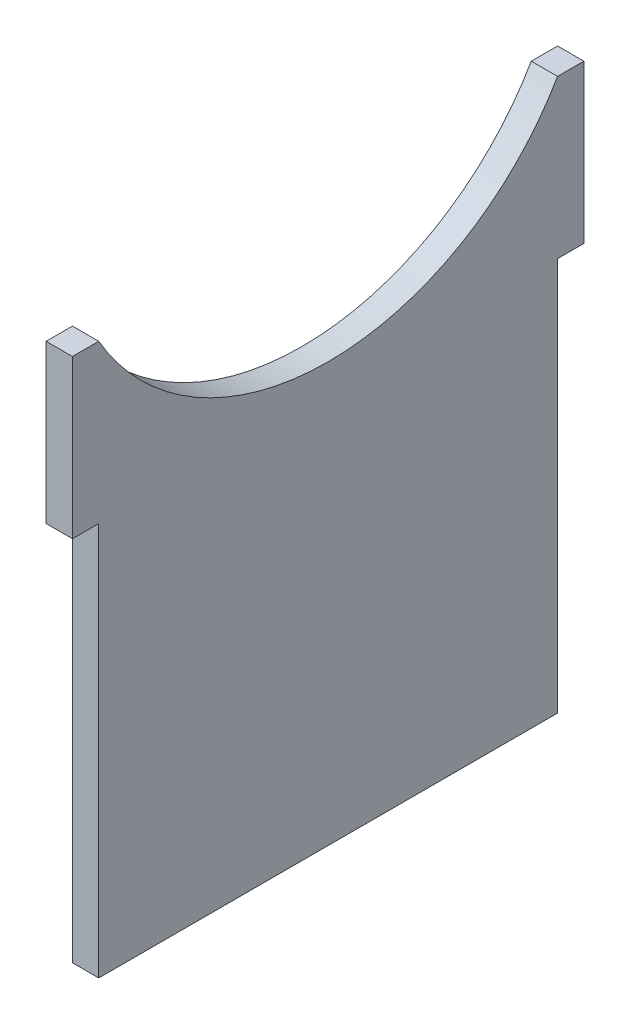
ISO-10303-21;
HEADER;
FILE_DESCRIPTION(('STEP AP214'),'2;1');
FILE_NAME('part.step','',(''),(''),'','','');
FILE_SCHEMA(('AUTOMOTIVE_DESIGN { 1 0 10303 214 1 1 1 1 }'));
ENDSEC;
DATA;
#1=APPLICATION_CONTEXT('core data for automotive mechanical design processes');
#2=APPLICATION_PROTOCOL_DEFINITION('international standard','automotive_design',2000,#1);
#3=PRODUCT_CONTEXT('',#1,'mechanical');
#4=PRODUCT('Part','Part','',(#3));
#5=PRODUCT_RELATED_PRODUCT_CATEGORY('part','',(#4));
#6=PRODUCT_DEFINITION_FORMATION('','',#4);
#7=PRODUCT_DEFINITION_CONTEXT('part definition',#1,'design');
#8=PRODUCT_DEFINITION('design','',#6,#7);
#9=PRODUCT_DEFINITION_SHAPE('','',#8);
#10=(LENGTH_UNIT() NAMED_UNIT(*) SI_UNIT(.MILLI.,.METRE.));
#11=(NAMED_UNIT(*) PLANE_ANGLE_UNIT() SI_UNIT($,.RADIAN.));
#12=(NAMED_UNIT(*) SI_UNIT($,.STERADIAN.) SOLID_ANGLE_UNIT());
#13=UNCERTAINTY_MEASURE_WITH_UNIT(LENGTH_MEASURE(1.E-05),#10,'distance_accuracy_value','');
#14=(GEOMETRIC_REPRESENTATION_CONTEXT(3) GLOBAL_UNCERTAINTY_ASSIGNED_CONTEXT((#13)) GLOBAL_UNIT_ASSIGNED_CONTEXT((#10,
#11,#12)) REPRESENTATION_CONTEXT('',''));
#15=CARTESIAN_POINT('',(0.,0.,0.));
#16=DIRECTION('',(0.,0.,1.));
#17=DIRECTION('',(1.,0.,0.));
#18=AXIS2_PLACEMENT_3D('',#15,#16,#17);
#19=CARTESIAN_POINT('',(1.5875,0.,0.));
#20=DIRECTION('',(-1.,0.,0.));
#21=DIRECTION('',(0.,0.,1.));
#22=AXIS2_PLACEMENT_3D('',#19,#20,#21);
#23=CYLINDRICAL_SURFACE('',#22,15.984519552784);
#24=CARTESIAN_POINT('',(0.,0.,0.));
#25=DIRECTION('',(1.,0.,0.));
#26=DIRECTION('',(0.,0.,-1.));
#27=AXIS2_PLACEMENT_3D('',#24,#25,#26);
#28=CIRCLE('',#27,15.984519552784);
#29=CARTESIAN_POINT('',(0.,-7.99225977639199,13.843));
#30=VERTEX_POINT('',#29);
#31=CARTESIAN_POINT('',(0.,-7.99225977639199,-13.843));
#32=VERTEX_POINT('',#31);
#33=EDGE_CURVE('E152',#30,#32,#28,.T.);
#34=ORIENTED_EDGE('',*,*,#33,.F.);
#35=DIRECTION('',(-1.,0.,0.));
#36=VECTOR('',#35,1.);
#37=CARTESIAN_POINT('',(1.5875,-7.99225977639199,13.843));
#38=LINE('',#37,#36);
#39=CARTESIAN_POINT('',(1.5875,-7.99225977639199,13.843));
#40=VERTEX_POINT('',#39);
#41=EDGE_CURVE('E11',#40,#30,#38,.T.);
#42=ORIENTED_EDGE('',*,*,#41,.F.);
#43=CARTESIAN_POINT('',(1.5875,0.,0.));
#44=DIRECTION('',(1.,0.,0.));
#45=DIRECTION('',(0.,0.,-1.));
#46=AXIS2_PLACEMENT_3D('',#43,#44,#45);
#47=CIRCLE('',#46,15.984519552784);
#48=CARTESIAN_POINT('',(1.5875,-7.99225977639199,-13.843));
#49=VERTEX_POINT('',#48);
#50=EDGE_CURVE('E184',#40,#49,#47,.T.);
#51=ORIENTED_EDGE('',*,*,#50,.T.);
#52=DIRECTION('',(-1.,0.,0.));
#53=VECTOR('',#52,1.);
#54=CARTESIAN_POINT('',(1.5875,-7.99225977639199,-13.843));
#55=LINE('',#54,#53);
#56=EDGE_CURVE('E58',#49,#32,#55,.T.);
#57=ORIENTED_EDGE('',*,*,#56,.T.);
#58=EDGE_LOOP('',(#34,#42,#51,#57));
#59=FACE_BOUND('',#58,.T.);
#60=ADVANCED_FACE('F41',(#59),#23,.F.);
#61=CARTESIAN_POINT('',(1.5875,-7.99225977639199,0.));
#62=DIRECTION('',(0.,-1.,0.));
#63=DIRECTION('',(0.,0.,-1.));
#64=AXIS2_PLACEMENT_3D('',#61,#62,#63);
#65=PLANE('',#64);
#66=DIRECTION('',(0.,0.,1.));
#67=VECTOR('',#66,1.);
#68=CARTESIAN_POINT('',(0.,-7.99225977639199,0.));
#69=LINE('',#68,#67);
#70=CARTESIAN_POINT('',(0.,-7.99225977639199,15.4305));
#71=VERTEX_POINT('',#70);
#72=EDGE_CURVE('E155',#30,#71,#69,.T.);
#73=ORIENTED_EDGE('',*,*,#72,.T.);
#74=DIRECTION('',(-1.,0.,0.));
#75=VECTOR('',#74,1.);
#76=CARTESIAN_POINT('',(1.5875,-7.99225977639199,15.4305));
#77=LINE('',#76,#75);
#78=CARTESIAN_POINT('',(1.5875,-7.99225977639199,15.4305));
#79=VERTEX_POINT('',#78);
#80=EDGE_CURVE('E50',#79,#71,#77,.T.);
#81=ORIENTED_EDGE('',*,*,#80,.F.);
#82=DIRECTION('',(0.,0.,1.));
#83=VECTOR('',#82,1.);
#84=CARTESIAN_POINT('',(1.5875,-7.99225977639199,0.));
#85=LINE('',#84,#83);
#86=EDGE_CURVE('E233',#40,#79,#85,.T.);
#87=ORIENTED_EDGE('',*,*,#86,.F.);
#88=ORIENTED_EDGE('',*,*,#41,.T.);
#89=EDGE_LOOP('',(#73,#81,#87,#88));
#90=FACE_BOUND('',#89,.T.);
#91=ADVANCED_FACE('F258',(#90),#65,.F.);
#92=CARTESIAN_POINT('',(1.5875,0.,15.4305));
#93=DIRECTION('',(0.,0.,-1.));
#94=DIRECTION('',(0.,1.,0.));
#95=AXIS2_PLACEMENT_3D('',#92,#93,#94);
#96=PLANE('',#95);
#97=DIRECTION('',(0.,-1.,0.));
#98=VECTOR('',#97,1.);
#99=CARTESIAN_POINT('',(0.,0.,15.4305));
#100=LINE('',#99,#98);
#101=CARTESIAN_POINT('',(0.,-17.517259776392,15.4305));
#102=VERTEX_POINT('',#101);
#103=EDGE_CURVE('E158',#71,#102,#100,.T.);
#104=ORIENTED_EDGE('',*,*,#103,.T.);
#105=DIRECTION('',(-1.,0.,0.));
#106=VECTOR('',#105,1.);
#107=CARTESIAN_POINT('',(1.5875,-17.517259776392,15.4305));
#108=LINE('',#107,#106);
#109=CARTESIAN_POINT('',(1.5875,-17.517259776392,15.4305));
#110=VERTEX_POINT('',#109);
#111=EDGE_CURVE('E202',#110,#102,#108,.T.);
#112=ORIENTED_EDGE('',*,*,#111,.F.);
#113=DIRECTION('',(0.,-1.,0.));
#114=VECTOR('',#113,1.);
#115=CARTESIAN_POINT('',(1.5875,0.,15.4305));
#116=LINE('',#115,#114);
#117=EDGE_CURVE('E212',#79,#110,#116,.T.);
#118=ORIENTED_EDGE('',*,*,#117,.F.);
#119=ORIENTED_EDGE('',*,*,#80,.T.);
#120=EDGE_LOOP('',(#104,#112,#118,#119));
#121=FACE_BOUND('',#120,.T.);
#122=ADVANCED_FACE('F210',(#121),#96,.F.);
#123=CARTESIAN_POINT('',(1.5875,-17.517259776392,0.));
#124=DIRECTION('',(0.,-1.,0.));
#125=DIRECTION('',(0.,0.,-1.));
#126=AXIS2_PLACEMENT_3D('',#123,#124,#125);
#127=PLANE('',#126);
#128=DIRECTION('',(0.,0.,1.));
#129=VECTOR('',#128,1.);
#130=CARTESIAN_POINT('',(0.,-17.517259776392,0.));
#131=LINE('',#130,#129);
#132=CARTESIAN_POINT('',(0.,-17.517259776392,13.843));
#133=VERTEX_POINT('',#132);
#134=EDGE_CURVE('E162',#133,#102,#131,.T.);
#135=ORIENTED_EDGE('',*,*,#134,.F.);
#136=DIRECTION('',(-1.,0.,0.));
#137=VECTOR('',#136,1.);
#138=CARTESIAN_POINT('',(1.5875,-17.517259776392,13.843));
#139=LINE('',#138,#137);
#140=CARTESIAN_POINT('',(1.5875,-17.517259776392,13.843));
#141=VERTEX_POINT('',#140);
#142=EDGE_CURVE('E199',#141,#133,#139,.T.);
#143=ORIENTED_EDGE('',*,*,#142,.F.);
#144=DIRECTION('',(0.,0.,1.));
#145=VECTOR('',#144,1.);
#146=CARTESIAN_POINT('',(1.5875,-17.517259776392,0.));
#147=LINE('',#146,#145);
#148=EDGE_CURVE('E225',#141,#110,#147,.T.);
#149=ORIENTED_EDGE('',*,*,#148,.T.);
#150=ORIENTED_EDGE('',*,*,#111,.T.);
#151=EDGE_LOOP('',(#135,#143,#149,#150));
#152=FACE_BOUND('',#151,.T.);
#153=ADVANCED_FACE('F221',(#152),#127,.T.);
#154=CARTESIAN_POINT('',(1.5875,0.,13.843));
#155=DIRECTION('',(0.,0.,-1.));
#156=DIRECTION('',(0.,1.,0.));
#157=AXIS2_PLACEMENT_3D('',#154,#155,#156);
#158=PLANE('',#157);
#159=DIRECTION('',(0.,-1.,0.));
#160=VECTOR('',#159,1.);
#161=CARTESIAN_POINT('',(0.,0.,13.843));
#162=LINE('',#161,#160);
#163=CARTESIAN_POINT('',(0.,-41.2639549100223,13.843));
#164=VERTEX_POINT('',#163);
#165=EDGE_CURVE('E166',#133,#164,#162,.T.);
#166=ORIENTED_EDGE('',*,*,#165,.T.);
#167=DIRECTION('',(-1.,0.,0.));
#168=VECTOR('',#167,1.);
#169=CARTESIAN_POINT('',(1.5875,-41.2639549100223,13.843));
#170=LINE('',#169,#168);
#171=CARTESIAN_POINT('',(1.5875,-41.2639549100223,13.843));
#172=VERTEX_POINT('',#171);
#173=EDGE_CURVE('E195',#172,#164,#170,.T.);
#174=ORIENTED_EDGE('',*,*,#173,.F.);
#175=DIRECTION('',(0.,-1.,0.));
#176=VECTOR('',#175,1.);
#177=CARTESIAN_POINT('',(1.5875,0.,13.843));
#178=LINE('',#177,#176);
#179=EDGE_CURVE('E227',#141,#172,#178,.T.);
#180=ORIENTED_EDGE('',*,*,#179,.F.);
#181=ORIENTED_EDGE('',*,*,#142,.T.);
#182=EDGE_LOOP('',(#166,#174,#180,#181));
#183=FACE_BOUND('',#182,.T.);
#184=ADVANCED_FACE('F269',(#183),#158,.F.);
#185=CARTESIAN_POINT('',(1.5875,-41.2639549100223,0.));
#186=DIRECTION('',(0.,1.,0.));
#187=DIRECTION('',(0.,0.,1.));
#188=AXIS2_PLACEMENT_3D('',#185,#186,#187);
#189=PLANE('',#188);
#190=DIRECTION('',(0.,0.,-1.));
#191=VECTOR('',#190,1.);
#192=CARTESIAN_POINT('',(0.,-41.2639549100223,0.));
#193=LINE('',#192,#191);
#194=CARTESIAN_POINT('',(0.,-41.2639549100223,-13.843));
#195=VERTEX_POINT('',#194);
#196=EDGE_CURVE('E169',#164,#195,#193,.T.);
#197=ORIENTED_EDGE('',*,*,#196,.T.);
#198=DIRECTION('',(-1.,0.,0.));
#199=VECTOR('',#198,1.);
#200=CARTESIAN_POINT('',(1.5875,-41.2639549100223,-13.843));
#201=LINE('',#200,#199);
#202=CARTESIAN_POINT('',(1.5875,-41.2639549100223,-13.843));
#203=VERTEX_POINT('',#202);
#204=EDGE_CURVE('E191',#203,#195,#201,.T.);
#205=ORIENTED_EDGE('',*,*,#204,.F.);
#206=DIRECTION('',(0.,0.,-1.));
#207=VECTOR('',#206,1.);
#208=CARTESIAN_POINT('',(1.5875,-41.2639549100223,0.));
#209=LINE('',#208,#207);
#210=EDGE_CURVE('E231',#172,#203,#209,.T.);
#211=ORIENTED_EDGE('',*,*,#210,.F.);
#212=ORIENTED_EDGE('',*,*,#173,.T.);
#213=EDGE_LOOP('',(#197,#205,#211,#212));
#214=FACE_BOUND('',#213,.T.);
#215=ADVANCED_FACE('F243',(#214),#189,.F.);
#216=CARTESIAN_POINT('',(1.5875,0.,-13.843));
#217=DIRECTION('',(0.,0.,1.));
#218=DIRECTION('',(0.,-1.,0.));
#219=AXIS2_PLACEMENT_3D('',#216,#217,#218);
#220=PLANE('',#219);
#221=DIRECTION('',(0.,1.,0.));
#222=VECTOR('',#221,1.);
#223=CARTESIAN_POINT('',(0.,0.,-13.843));
#224=LINE('',#223,#222);
#225=CARTESIAN_POINT('',(0.,-17.517259776392,-13.843));
#226=VERTEX_POINT('',#225);
#227=EDGE_CURVE('E172',#195,#226,#224,.T.);
#228=ORIENTED_EDGE('',*,*,#227,.T.);
#229=DIRECTION('',(-1.,0.,0.));
#230=VECTOR('',#229,1.);
#231=CARTESIAN_POINT('',(1.5875,-17.517259776392,-13.843));
#232=LINE('',#231,#230);
#233=CARTESIAN_POINT('',(1.5875,-17.517259776392,-13.843));
#234=VERTEX_POINT('',#233);
#235=EDGE_CURVE('E142',#234,#226,#232,.T.);
#236=ORIENTED_EDGE('',*,*,#235,.F.);
#237=DIRECTION('',(0.,1.,0.));
#238=VECTOR('',#237,1.);
#239=CARTESIAN_POINT('',(1.5875,0.,-13.843));
#240=LINE('',#239,#238);
#241=EDGE_CURVE('E128',#203,#234,#240,.T.);
#242=ORIENTED_EDGE('',*,*,#241,.F.);
#243=ORIENTED_EDGE('',*,*,#204,.T.);
#244=EDGE_LOOP('',(#228,#236,#242,#243));
#245=FACE_BOUND('',#244,.T.);
#246=ADVANCED_FACE('F246',(#245),#220,.F.);
#247=CARTESIAN_POINT('',(1.5875,-17.517259776392,0.));
#248=DIRECTION('',(0.,1.,0.));
#249=DIRECTION('',(0.,0.,1.));
#250=AXIS2_PLACEMENT_3D('',#247,#248,#249);
#251=PLANE('',#250);
#252=DIRECTION('',(0.,0.,-1.));
#253=VECTOR('',#252,1.);
#254=CARTESIAN_POINT('',(0.,-17.517259776392,0.));
#255=LINE('',#254,#253);
#256=CARTESIAN_POINT('',(0.,-17.517259776392,-15.4305));
#257=VERTEX_POINT('',#256);
#258=EDGE_CURVE('E138',#226,#257,#255,.T.);
#259=ORIENTED_EDGE('',*,*,#258,.T.);
#260=DIRECTION('',(-1.,0.,0.));
#261=VECTOR('',#260,1.);
#262=CARTESIAN_POINT('',(1.5875,-17.517259776392,-15.4305));
#263=LINE('',#262,#261);
#264=CARTESIAN_POINT('',(1.5875,-17.517259776392,-15.4305));
#265=VERTEX_POINT('',#264);
#266=EDGE_CURVE('E135',#265,#257,#263,.T.);
#267=ORIENTED_EDGE('',*,*,#266,.F.);
#268=DIRECTION('',(0.,0.,-1.));
#269=VECTOR('',#268,1.);
#270=CARTESIAN_POINT('',(1.5875,-17.517259776392,0.));
#271=LINE('',#270,#269);
#272=EDGE_CURVE('E120',#234,#265,#271,.T.);
#273=ORIENTED_EDGE('',*,*,#272,.F.);
#274=ORIENTED_EDGE('',*,*,#235,.T.);
#275=EDGE_LOOP('',(#259,#267,#273,#274));
#276=FACE_BOUND('',#275,.T.);
#277=ADVANCED_FACE('F136',(#276),#251,.F.);
#278=CARTESIAN_POINT('',(1.5875,0.,-15.4305));
#279=DIRECTION('',(0.,0.,-1.));
#280=DIRECTION('',(0.,1.,0.));
#281=AXIS2_PLACEMENT_3D('',#278,#279,#280);
#282=PLANE('',#281);
#283=DIRECTION('',(0.,-1.,0.));
#284=VECTOR('',#283,1.);
#285=CARTESIAN_POINT('',(0.,0.,-15.4305));
#286=LINE('',#285,#284);
#287=CARTESIAN_POINT('',(0.,-7.99225977639199,-15.4305));
#288=VERTEX_POINT('',#287);
#289=EDGE_CURVE('E177',#288,#257,#286,.T.);
#290=ORIENTED_EDGE('',*,*,#289,.F.);
#291=DIRECTION('',(-1.,0.,0.));
#292=VECTOR('',#291,1.);
#293=CARTESIAN_POINT('',(1.5875,-7.99225977639199,-15.4305));
#294=LINE('',#293,#292);
#295=CARTESIAN_POINT('',(1.5875,-7.99225977639199,-15.4305));
#296=VERTEX_POINT('',#295);
#297=EDGE_CURVE('E89',#296,#288,#294,.T.);
#298=ORIENTED_EDGE('',*,*,#297,.F.);
#299=DIRECTION('',(0.,-1.,0.));
#300=VECTOR('',#299,1.);
#301=CARTESIAN_POINT('',(1.5875,0.,-15.4305));
#302=LINE('',#301,#300);
#303=EDGE_CURVE('E126',#296,#265,#302,.T.);
#304=ORIENTED_EDGE('',*,*,#303,.T.);
#305=ORIENTED_EDGE('',*,*,#266,.T.);
#306=EDGE_LOOP('',(#290,#298,#304,#305));
#307=FACE_BOUND('',#306,.T.);
#308=ADVANCED_FACE('F144',(#307),#282,.T.);
#309=CARTESIAN_POINT('',(1.5875,-7.99225977639199,0.));
#310=DIRECTION('',(0.,1.,0.));
#311=DIRECTION('',(0.,0.,1.));
#312=AXIS2_PLACEMENT_3D('',#309,#310,#311);
#313=PLANE('',#312);
#314=DIRECTION('',(0.,0.,-1.));
#315=VECTOR('',#314,1.);
#316=CARTESIAN_POINT('',(0.,-7.99225977639199,0.));
#317=LINE('',#316,#315);
#318=EDGE_CURVE('E180',#32,#288,#317,.T.);
#319=ORIENTED_EDGE('',*,*,#318,.F.);
#320=ORIENTED_EDGE('',*,*,#56,.F.);
#321=DIRECTION('',(0.,0.,-1.));
#322=VECTOR('',#321,1.);
#323=CARTESIAN_POINT('',(1.5875,-7.99225977639199,0.));
#324=LINE('',#323,#322);
#325=EDGE_CURVE('E146',#49,#296,#324,.T.);
#326=ORIENTED_EDGE('',*,*,#325,.T.);
#327=ORIENTED_EDGE('',*,*,#297,.T.);
#328=EDGE_LOOP('',(#319,#320,#326,#327));
#329=FACE_BOUND('',#328,.T.);
#330=ADVANCED_FACE('F247',(#329),#313,.T.);
#331=CARTESIAN_POINT('',(1.5875,0.,0.));
#332=DIRECTION('',(1.,0.,0.));
#333=DIRECTION('',(0.,0.,-1.));
#334=AXIS2_PLACEMENT_3D('',#331,#332,#333);
#335=PLANE('',#334);
#336=ORIENTED_EDGE('',*,*,#50,.F.);
#337=ORIENTED_EDGE('',*,*,#86,.T.);
#338=ORIENTED_EDGE('',*,*,#117,.T.);
#339=ORIENTED_EDGE('',*,*,#148,.F.);
#340=ORIENTED_EDGE('',*,*,#179,.T.);
#341=ORIENTED_EDGE('',*,*,#210,.T.);
#342=ORIENTED_EDGE('',*,*,#241,.T.);
#343=ORIENTED_EDGE('',*,*,#272,.T.);
#344=ORIENTED_EDGE('',*,*,#303,.F.);
#345=ORIENTED_EDGE('',*,*,#325,.F.);
#346=EDGE_LOOP('',(#336,#337,#338,#339,#340,#341,#342,#343,#344,#345));
#347=FACE_BOUND('',#346,.T.);
#348=ADVANCED_FACE('F123',(#347),#335,.T.);
#349=CARTESIAN_POINT('',(0.,0.,0.));
#350=DIRECTION('',(1.,0.,0.));
#351=DIRECTION('',(0.,0.,-1.));
#352=AXIS2_PLACEMENT_3D('',#349,#350,#351);
#353=PLANE('',#352);
#354=ORIENTED_EDGE('',*,*,#33,.T.);
#355=ORIENTED_EDGE('',*,*,#318,.T.);
#356=ORIENTED_EDGE('',*,*,#289,.T.);
#357=ORIENTED_EDGE('',*,*,#258,.F.);
#358=ORIENTED_EDGE('',*,*,#227,.F.);
#359=ORIENTED_EDGE('',*,*,#196,.F.);
#360=ORIENTED_EDGE('',*,*,#165,.F.);
#361=ORIENTED_EDGE('',*,*,#134,.T.);
#362=ORIENTED_EDGE('',*,*,#103,.F.);
#363=ORIENTED_EDGE('',*,*,#72,.F.);
#364=EDGE_LOOP('',(#354,#355,#356,#357,#358,#359,#360,#361,#362,#363));
#365=FACE_BOUND('',#364,.T.);
#366=ADVANCED_FACE('F216',(#365),#353,.F.);
#367=CLOSED_SHELL('',(#60,#91,#122,#153,#184,#215,#246,#277,#308,#330,#348,#366));
#368=MANIFOLD_SOLID_BREP('B2',#367);
#369=ADVANCED_BREP_SHAPE_REPRESENTATION('',(#18,#368),#14);
#370=SHAPE_DEFINITION_REPRESENTATION(#9,#369);
ENDSEC;
END-ISO-10303-21;
